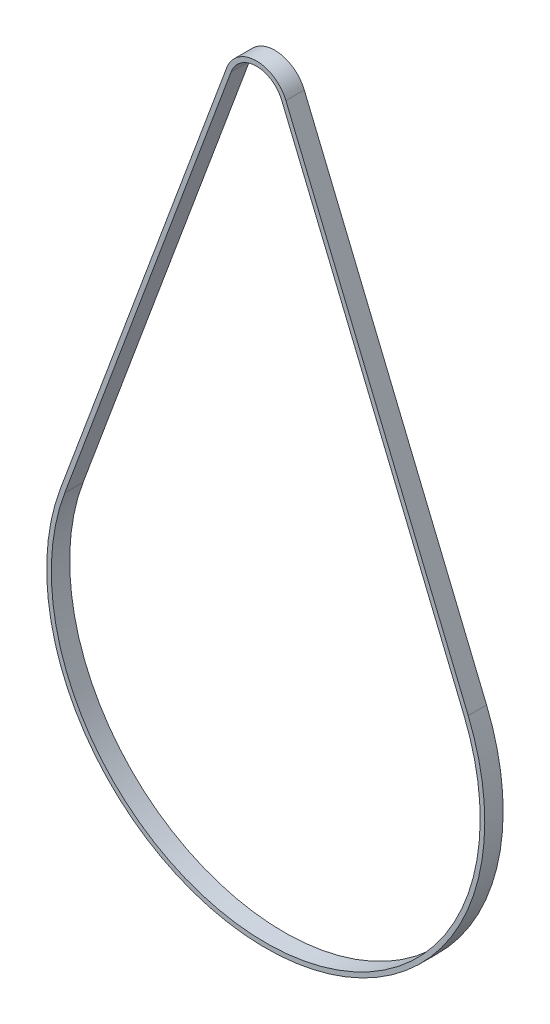
ISO-10303-21;
HEADER;
FILE_DESCRIPTION(('STEP AP214'),'2;1');
FILE_NAME('part.step','',(''),(''),'','','');
FILE_SCHEMA(('AUTOMOTIVE_DESIGN { 1 0 10303 214 1 1 1 1 }'));
ENDSEC;
DATA;
#1=APPLICATION_CONTEXT('core data for automotive mechanical design processes');
#2=APPLICATION_PROTOCOL_DEFINITION('international standard','automotive_design',2000,#1);
#3=PRODUCT_CONTEXT('',#1,'mechanical');
#4=PRODUCT('Part','Part','',(#3));
#5=PRODUCT_RELATED_PRODUCT_CATEGORY('part','',(#4));
#6=PRODUCT_DEFINITION_FORMATION('','',#4);
#7=PRODUCT_DEFINITION_CONTEXT('part definition',#1,'design');
#8=PRODUCT_DEFINITION('design','',#6,#7);
#9=PRODUCT_DEFINITION_SHAPE('','',#8);
#10=(LENGTH_UNIT() NAMED_UNIT(*) SI_UNIT(.MILLI.,.METRE.));
#11=(NAMED_UNIT(*) PLANE_ANGLE_UNIT() SI_UNIT($,.RADIAN.));
#12=(NAMED_UNIT(*) SI_UNIT($,.STERADIAN.) SOLID_ANGLE_UNIT());
#13=UNCERTAINTY_MEASURE_WITH_UNIT(LENGTH_MEASURE(1.E-05),#10,'distance_accuracy_value','');
#14=(GEOMETRIC_REPRESENTATION_CONTEXT(3) GLOBAL_UNCERTAINTY_ASSIGNED_CONTEXT((#13)) GLOBAL_UNIT_ASSIGNED_CONTEXT((#10,
#11,#12)) REPRESENTATION_CONTEXT('',''));
#15=CARTESIAN_POINT('',(0.,0.,0.));
#16=DIRECTION('',(0.,0.,1.));
#17=DIRECTION('',(1.,0.,0.));
#18=AXIS2_PLACEMENT_3D('',#15,#16,#17);
#19=CARTESIAN_POINT('',(-15.7568487406425,-162.552272750274,6.));
#20=DIRECTION('',(0.,0.,-1.));
#21=DIRECTION('',(-1.,0.,0.));
#22=AXIS2_PLACEMENT_3D('',#19,#20,#21);
#23=PLANE('',#22);
#24=CARTESIAN_POINT('',(-15.7568487406425,-162.552272750274,6.));
#25=DIRECTION('',(0.,0.,-1.));
#26=DIRECTION('',(-1.,0.,0.));
#27=AXIS2_PLACEMENT_3D('',#24,#25,#26);
#28=CIRCLE('',#27,71.5);
#29=CARTESIAN_POINT('',(-82.7800137141816,-137.649554887964,6.));
#30=VERTEX_POINT('',#29);
#31=CARTESIAN_POINT('',(50.3312475446902,-135.264665134717,6.));
#32=VERTEX_POINT('',#31);
#33=EDGE_CURVE('E164',#30,#32,#28,.F.);
#34=ORIENTED_EDGE('',*,*,#33,.T.);
#35=DIRECTION('',(-0.381644861756041,0.924309038955702,0.));
#36=VECTOR('',#35,1.);
#37=CARTESIAN_POINT('',(50.3312475446901,-135.264665134717,6.));
#38=LINE('',#37,#36);
#39=CARTESIAN_POINT('',(-9.17269107863369,8.84844586050283,6.));
#40=VERTEX_POINT('',#39);
#41=EDGE_CURVE('E167',#32,#40,#38,.T.);
#42=ORIENTED_EDGE('',*,*,#41,.T.);
#43=CARTESIAN_POINT('',(-18.7568515035654,4.89117028895444,6.));
#44=DIRECTION('',(0.,0.,-1.));
#45=DIRECTION('',(-1.,0.,0.));
#46=AXIS2_PLACEMENT_3D('',#43,#44,#45);
#47=CIRCLE('',#46,10.369);
#48=CARTESIAN_POINT('',(-28.4766165051126,8.50258681362976,6.));
#49=VERTEX_POINT('',#48);
#50=EDGE_CURVE('E170',#40,#49,#47,.F.);
#51=ORIENTED_EDGE('',*,*,#50,.T.);
#52=DIRECTION('',(-0.348289760312018,-0.937386922706839,0.));
#53=VECTOR('',#52,1.);
#54=CARTESIAN_POINT('',(-82.7800137141816,-137.649554887964,6.));
#55=LINE('',#54,#53);
#56=EDGE_CURVE('E172',#49,#30,#55,.T.);
#57=ORIENTED_EDGE('',*,*,#56,.T.);
#58=EDGE_LOOP('',(#34,#42,#51,#57));
#59=FACE_BOUND('',#58,.T.);
#60=CARTESIAN_POINT('',(-15.7568487406425,-162.552272750274,6.));
#61=DIRECTION('',(0.,0.,-1.));
#62=DIRECTION('',(-1.,0.,0.));
#63=AXIS2_PLACEMENT_3D('',#60,#61,#62);
#64=CIRCLE('',#63,70.);
#65=CARTESIAN_POINT('',(-81.3739333301213,-138.171989528432,6.));
#66=VERTEX_POINT('',#65);
#67=CARTESIAN_POINT('',(48.9447839862566,-135.837132427351,6.));
#68=VERTEX_POINT('',#67);
#69=EDGE_CURVE('E128',#66,#68,#64,.F.);
#70=ORIENTED_EDGE('',*,*,#69,.F.);
#71=DIRECTION('',(-0.348289760312018,-0.937386922706839,0.));
#72=VECTOR('',#71,1.);
#73=CARTESIAN_POINT('',(-81.3739333301213,-138.171989528432,6.));
#74=LINE('',#73,#72);
#75=CARTESIAN_POINT('',(-27.0705361210523,7.98015217316173,6.));
#76=VERTEX_POINT('',#75);
#77=EDGE_CURVE('E150',#76,#66,#74,.T.);
#78=ORIENTED_EDGE('',*,*,#77,.F.);
#79=CARTESIAN_POINT('',(-18.7568515035654,4.89117028895444,6.));
#80=DIRECTION('',(0.,0.,-1.));
#81=DIRECTION('',(-1.,0.,0.));
#82=AXIS2_PLACEMENT_3D('',#79,#80,#81);
#83=CIRCLE('',#82,8.869);
#84=CARTESIAN_POINT('',(-10.5591546370672,8.27597856786877,6.));
#85=VERTEX_POINT('',#84);
#86=EDGE_CURVE('E148',#85,#76,#83,.F.);
#87=ORIENTED_EDGE('',*,*,#86,.F.);
#88=DIRECTION('',(-0.381644861756041,0.924309038955702,0.));
#89=VECTOR('',#88,1.);
#90=CARTESIAN_POINT('',(48.9447839862566,-135.837132427351,6.));
#91=LINE('',#90,#89);
#92=EDGE_CURVE('E136',#68,#85,#91,.T.);
#93=ORIENTED_EDGE('',*,*,#92,.F.);
#94=EDGE_LOOP('',(#70,#78,#87,#93));
#95=FACE_BOUND('',#94,.T.);
#96=ADVANCED_FACE('F63',(#59,#95),#23,.F.);
#97=CARTESIAN_POINT('',(-15.7568487406425,-162.552272750274,0.));
#98=DIRECTION('',(0.,0.,-1.));
#99=DIRECTION('',(-1.,0.,0.));
#100=AXIS2_PLACEMENT_3D('',#97,#98,#99);
#101=PLANE('',#100);
#102=CARTESIAN_POINT('',(-15.7568487406425,-162.552272750274,0.));
#103=DIRECTION('',(0.,0.,-1.));
#104=DIRECTION('',(-1.,0.,0.));
#105=AXIS2_PLACEMENT_3D('',#102,#103,#104);
#106=CIRCLE('',#105,71.5);
#107=CARTESIAN_POINT('',(-82.7800137141816,-137.649554887964,0.));
#108=VERTEX_POINT('',#107);
#109=CARTESIAN_POINT('',(50.3312475446902,-135.264665134717,0.));
#110=VERTEX_POINT('',#109);
#111=EDGE_CURVE('E144',#108,#110,#106,.F.);
#112=ORIENTED_EDGE('',*,*,#111,.F.);
#113=DIRECTION('',(-0.348289760312018,-0.937386922706839,0.));
#114=VECTOR('',#113,1.);
#115=CARTESIAN_POINT('',(-82.7800137141816,-137.649554887964,0.));
#116=LINE('',#115,#114);
#117=CARTESIAN_POINT('',(-28.4766165051126,8.50258681362976,0.));
#118=VERTEX_POINT('',#117);
#119=EDGE_CURVE('E168',#118,#108,#116,.T.);
#120=ORIENTED_EDGE('',*,*,#119,.F.);
#121=CARTESIAN_POINT('',(-18.7568515035654,4.89117028895444,0.));
#122=DIRECTION('',(0.,0.,-1.));
#123=DIRECTION('',(-1.,0.,0.));
#124=AXIS2_PLACEMENT_3D('',#121,#122,#123);
#125=CIRCLE('',#124,10.369);
#126=CARTESIAN_POINT('',(-9.17269107863369,8.84844586050283,0.));
#127=VERTEX_POINT('',#126);
#128=EDGE_CURVE('E179',#127,#118,#125,.F.);
#129=ORIENTED_EDGE('',*,*,#128,.F.);
#130=DIRECTION('',(-0.381644861756041,0.924309038955702,0.));
#131=VECTOR('',#130,1.);
#132=CARTESIAN_POINT('',(50.3312475446901,-135.264665134717,0.));
#133=LINE('',#132,#131);
#134=EDGE_CURVE('E177',#110,#127,#133,.T.);
#135=ORIENTED_EDGE('',*,*,#134,.F.);
#136=EDGE_LOOP('',(#112,#120,#129,#135));
#137=FACE_BOUND('',#136,.T.);
#138=DIRECTION('',(-0.348289760312018,-0.937386922706839,0.));
#139=VECTOR('',#138,1.);
#140=CARTESIAN_POINT('',(-81.3739333301213,-138.171989528432,0.));
#141=LINE('',#140,#139);
#142=CARTESIAN_POINT('',(-27.0705361210523,7.98015217316173,0.));
#143=VERTEX_POINT('',#142);
#144=CARTESIAN_POINT('',(-81.3739333301213,-138.171989528432,0.));
#145=VERTEX_POINT('',#144);
#146=EDGE_CURVE('E137',#143,#145,#141,.T.);
#147=ORIENTED_EDGE('',*,*,#146,.T.);
#148=CARTESIAN_POINT('',(-15.7568487406425,-162.552272750274,0.));
#149=DIRECTION('',(0.,0.,-1.));
#150=DIRECTION('',(-1.,0.,0.));
#151=AXIS2_PLACEMENT_3D('',#148,#149,#150);
#152=CIRCLE('',#151,70.);
#153=CARTESIAN_POINT('',(48.9447839862566,-135.837132427351,0.));
#154=VERTEX_POINT('',#153);
#155=EDGE_CURVE('E86',#145,#154,#152,.F.);
#156=ORIENTED_EDGE('',*,*,#155,.T.);
#157=DIRECTION('',(-0.381644861756041,0.924309038955702,0.));
#158=VECTOR('',#157,1.);
#159=CARTESIAN_POINT('',(48.9447839862566,-135.837132427351,0.));
#160=LINE('',#159,#158);
#161=CARTESIAN_POINT('',(-10.5591546370672,8.27597856786877,0.));
#162=VERTEX_POINT('',#161);
#163=EDGE_CURVE('E143',#154,#162,#160,.T.);
#164=ORIENTED_EDGE('',*,*,#163,.T.);
#165=CARTESIAN_POINT('',(-18.7568515035654,4.89117028895444,0.));
#166=DIRECTION('',(0.,0.,-1.));
#167=DIRECTION('',(-1.,0.,0.));
#168=AXIS2_PLACEMENT_3D('',#165,#166,#167);
#169=CIRCLE('',#168,8.869);
#170=EDGE_CURVE('E156',#162,#143,#169,.F.);
#171=ORIENTED_EDGE('',*,*,#170,.T.);
#172=EDGE_LOOP('',(#147,#156,#164,#171));
#173=FACE_BOUND('',#172,.T.);
#174=ADVANCED_FACE('F197',(#137,#173),#101,.T.);
#175=CARTESIAN_POINT('',(-15.7568487406425,-162.552272750274,6.));
#176=DIRECTION('',(0.,0.,-1.));
#177=DIRECTION('',(-1.,0.,0.));
#178=AXIS2_PLACEMENT_3D('',#175,#176,#177);
#179=CYLINDRICAL_SURFACE('',#178,71.5);
#180=ORIENTED_EDGE('',*,*,#111,.T.);
#181=DIRECTION('',(0.,0.,-1.));
#182=VECTOR('',#181,1.);
#183=CARTESIAN_POINT('',(50.3312475446902,-135.264665134717,6.));
#184=LINE('',#183,#182);
#185=EDGE_CURVE('E12',#32,#110,#184,.T.);
#186=ORIENTED_EDGE('',*,*,#185,.F.);
#187=ORIENTED_EDGE('',*,*,#33,.F.);
#188=DIRECTION('',(0.,0.,-1.));
#189=VECTOR('',#188,1.);
#190=CARTESIAN_POINT('',(-82.7800137141816,-137.649554887964,6.));
#191=LINE('',#190,#189);
#192=EDGE_CURVE('E174',#30,#108,#191,.T.);
#193=ORIENTED_EDGE('',*,*,#192,.T.);
#194=EDGE_LOOP('',(#180,#186,#187,#193));
#195=FACE_BOUND('',#194,.T.);
#196=ADVANCED_FACE('F65',(#195),#179,.T.);
#197=CARTESIAN_POINT('',(50.3312475446901,-135.264665134717,6.));
#198=DIRECTION('',(-0.924309038955701,-0.381644861756041,0.));
#199=DIRECTION('',(0.381644861756041,-0.924309038955702,0.));
#200=AXIS2_PLACEMENT_3D('',#197,#198,#199);
#201=PLANE('',#200);
#202=ORIENTED_EDGE('',*,*,#134,.T.);
#203=DIRECTION('',(0.,0.,-1.));
#204=VECTOR('',#203,1.);
#205=CARTESIAN_POINT('',(-9.17269107863369,8.84844586050283,6.));
#206=LINE('',#205,#204);
#207=EDGE_CURVE('E71',#40,#127,#206,.T.);
#208=ORIENTED_EDGE('',*,*,#207,.F.);
#209=ORIENTED_EDGE('',*,*,#41,.F.);
#210=ORIENTED_EDGE('',*,*,#185,.T.);
#211=EDGE_LOOP('',(#202,#208,#209,#210));
#212=FACE_BOUND('',#211,.T.);
#213=ADVANCED_FACE('F207',(#212),#201,.F.);
#214=CARTESIAN_POINT('',(-18.7568515035654,4.89117028895444,6.));
#215=DIRECTION('',(0.,0.,-1.));
#216=DIRECTION('',(-1.,0.,0.));
#217=AXIS2_PLACEMENT_3D('',#214,#215,#216);
#218=CYLINDRICAL_SURFACE('',#217,10.369);
#219=ORIENTED_EDGE('',*,*,#128,.T.);
#220=DIRECTION('',(0.,0.,-1.));
#221=VECTOR('',#220,1.);
#222=CARTESIAN_POINT('',(-28.4766165051126,8.50258681362976,6.));
#223=LINE('',#222,#221);
#224=EDGE_CURVE('E184',#49,#118,#223,.T.);
#225=ORIENTED_EDGE('',*,*,#224,.F.);
#226=ORIENTED_EDGE('',*,*,#50,.F.);
#227=ORIENTED_EDGE('',*,*,#207,.T.);
#228=EDGE_LOOP('',(#219,#225,#226,#227));
#229=FACE_BOUND('',#228,.T.);
#230=ADVANCED_FACE('F191',(#229),#218,.T.);
#231=CARTESIAN_POINT('',(-82.7800137141816,-137.649554887964,6.));
#232=DIRECTION('',(0.937386922706839,-0.348289760312018,0.));
#233=DIRECTION('',(0.348289760312018,0.937386922706839,0.));
#234=AXIS2_PLACEMENT_3D('',#231,#232,#233);
#235=PLANE('',#234);
#236=ORIENTED_EDGE('',*,*,#119,.T.);
#237=ORIENTED_EDGE('',*,*,#192,.F.);
#238=ORIENTED_EDGE('',*,*,#56,.F.);
#239=ORIENTED_EDGE('',*,*,#224,.T.);
#240=EDGE_LOOP('',(#236,#237,#238,#239));
#241=FACE_BOUND('',#240,.T.);
#242=ADVANCED_FACE('F201',(#241),#235,.F.);
#243=CARTESIAN_POINT('',(-15.7568487406425,-162.552272750274,6.));
#244=DIRECTION('',(0.,0.,-1.));
#245=DIRECTION('',(-1.,0.,0.));
#246=AXIS2_PLACEMENT_3D('',#243,#244,#245);
#247=CYLINDRICAL_SURFACE('',#246,70.);
#248=ORIENTED_EDGE('',*,*,#155,.F.);
#249=DIRECTION('',(0.,0.,-1.));
#250=VECTOR('',#249,1.);
#251=CARTESIAN_POINT('',(-81.3739333301213,-138.171989528432,6.));
#252=LINE('',#251,#250);
#253=EDGE_CURVE('E132',#66,#145,#252,.T.);
#254=ORIENTED_EDGE('',*,*,#253,.F.);
#255=ORIENTED_EDGE('',*,*,#69,.T.);
#256=DIRECTION('',(0.,0.,-1.));
#257=VECTOR('',#256,1.);
#258=CARTESIAN_POINT('',(48.9447839862566,-135.837132427351,6.));
#259=LINE('',#258,#257);
#260=EDGE_CURVE('E131',#68,#154,#259,.T.);
#261=ORIENTED_EDGE('',*,*,#260,.T.);
#262=EDGE_LOOP('',(#248,#254,#255,#261));
#263=FACE_BOUND('',#262,.T.);
#264=ADVANCED_FACE('F130',(#263),#247,.F.);
#265=CARTESIAN_POINT('',(48.9447839862566,-135.837132427351,6.));
#266=DIRECTION('',(-0.924309038955701,-0.381644861756041,0.));
#267=DIRECTION('',(0.381644861756041,-0.924309038955702,0.));
#268=AXIS2_PLACEMENT_3D('',#265,#266,#267);
#269=PLANE('',#268);
#270=ORIENTED_EDGE('',*,*,#163,.F.);
#271=ORIENTED_EDGE('',*,*,#260,.F.);
#272=ORIENTED_EDGE('',*,*,#92,.T.);
#273=DIRECTION('',(0.,0.,-1.));
#274=VECTOR('',#273,1.);
#275=CARTESIAN_POINT('',(-10.5591546370672,8.27597856786877,6.));
#276=LINE('',#275,#274);
#277=EDGE_CURVE('E145',#85,#162,#276,.T.);
#278=ORIENTED_EDGE('',*,*,#277,.T.);
#279=EDGE_LOOP('',(#270,#271,#272,#278));
#280=FACE_BOUND('',#279,.T.);
#281=ADVANCED_FACE('F140',(#280),#269,.T.);
#282=CARTESIAN_POINT('',(-18.7568515035654,4.89117028895444,6.));
#283=DIRECTION('',(0.,0.,-1.));
#284=DIRECTION('',(-1.,0.,0.));
#285=AXIS2_PLACEMENT_3D('',#282,#283,#284);
#286=CYLINDRICAL_SURFACE('',#285,8.869);
#287=ORIENTED_EDGE('',*,*,#170,.F.);
#288=ORIENTED_EDGE('',*,*,#277,.F.);
#289=ORIENTED_EDGE('',*,*,#86,.T.);
#290=DIRECTION('',(0.,0.,-1.));
#291=VECTOR('',#290,1.);
#292=CARTESIAN_POINT('',(-27.0705361210523,7.98015217316173,6.));
#293=LINE('',#292,#291);
#294=EDGE_CURVE('E78',#76,#143,#293,.T.);
#295=ORIENTED_EDGE('',*,*,#294,.T.);
#296=EDGE_LOOP('',(#287,#288,#289,#295));
#297=FACE_BOUND('',#296,.T.);
#298=ADVANCED_FACE('F230',(#297),#286,.F.);
#299=CARTESIAN_POINT('',(-81.3739333301213,-138.171989528432,6.));
#300=DIRECTION('',(0.937386922706839,-0.348289760312018,0.));
#301=DIRECTION('',(0.348289760312018,0.937386922706839,0.));
#302=AXIS2_PLACEMENT_3D('',#299,#300,#301);
#303=PLANE('',#302);
#304=ORIENTED_EDGE('',*,*,#146,.F.);
#305=ORIENTED_EDGE('',*,*,#294,.F.);
#306=ORIENTED_EDGE('',*,*,#77,.T.);
#307=ORIENTED_EDGE('',*,*,#253,.T.);
#308=EDGE_LOOP('',(#304,#305,#306,#307));
#309=FACE_BOUND('',#308,.T.);
#310=ADVANCED_FACE('F234',(#309),#303,.T.);
#311=CLOSED_SHELL('',(#96,#174,#196,#213,#230,#242,#264,#281,#298,#310));
#312=MANIFOLD_SOLID_BREP('B2',#311);
#313=ADVANCED_BREP_SHAPE_REPRESENTATION('',(#18,#312),#14);
#314=SHAPE_DEFINITION_REPRESENTATION(#9,#313);
ENDSEC;
END-ISO-10303-21;
